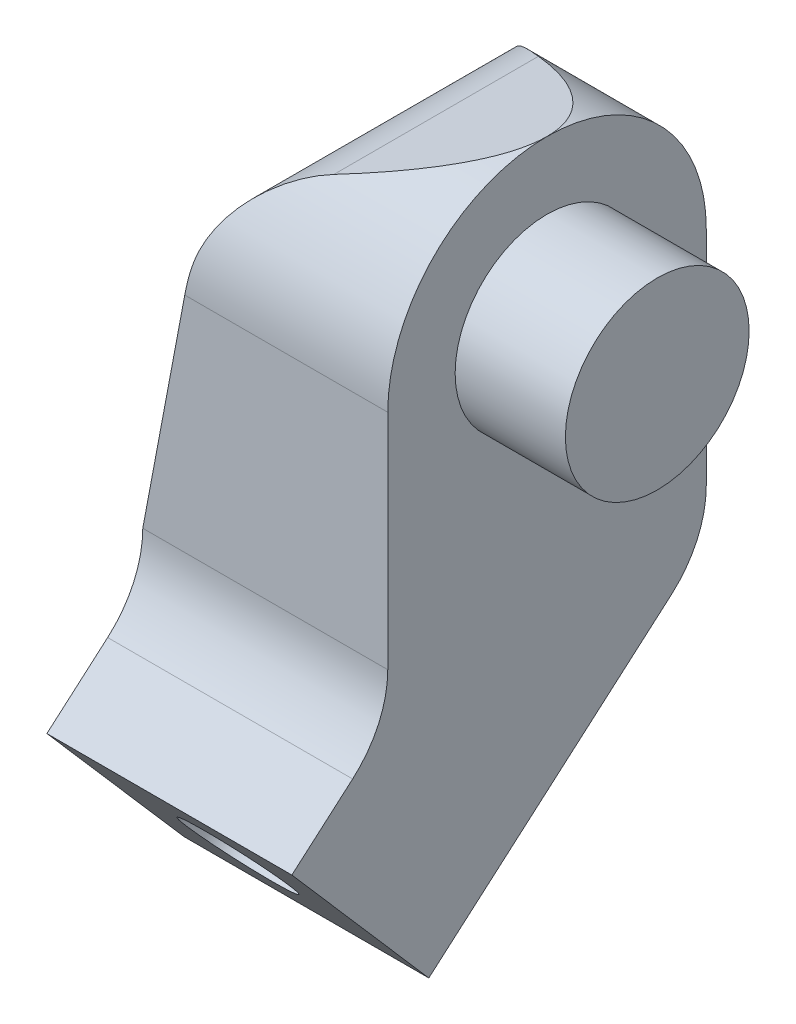
ISO-10303-21;
HEADER;
FILE_DESCRIPTION(('STEP AP214'),'2;1');
FILE_NAME('part.step','',(''),(''),'','','');
FILE_SCHEMA(('AUTOMOTIVE_DESIGN { 1 0 10303 214 1 1 1 1 }'));
ENDSEC;
DATA;
#1=APPLICATION_CONTEXT('core data for automotive mechanical design processes');
#2=APPLICATION_PROTOCOL_DEFINITION('international standard','automotive_design',2000,#1);
#3=PRODUCT_CONTEXT('',#1,'mechanical');
#4=PRODUCT('Part','Part','',(#3));
#5=PRODUCT_RELATED_PRODUCT_CATEGORY('part','',(#4));
#6=PRODUCT_DEFINITION_FORMATION('','',#4);
#7=PRODUCT_DEFINITION_CONTEXT('part definition',#1,'design');
#8=PRODUCT_DEFINITION('design','',#6,#7);
#9=PRODUCT_DEFINITION_SHAPE('','',#8);
#10=(LENGTH_UNIT() NAMED_UNIT(*) SI_UNIT(.MILLI.,.METRE.));
#11=(NAMED_UNIT(*) PLANE_ANGLE_UNIT() SI_UNIT($,.RADIAN.));
#12=(NAMED_UNIT(*) SI_UNIT($,.STERADIAN.) SOLID_ANGLE_UNIT());
#13=UNCERTAINTY_MEASURE_WITH_UNIT(LENGTH_MEASURE(1.E-05),#10,'distance_accuracy_value','');
#14=(GEOMETRIC_REPRESENTATION_CONTEXT(3) GLOBAL_UNCERTAINTY_ASSIGNED_CONTEXT((#13)) GLOBAL_UNIT_ASSIGNED_CONTEXT((#10,
#11,#12)) REPRESENTATION_CONTEXT('',''));
#15=CARTESIAN_POINT('',(0.,0.,0.));
#16=DIRECTION('',(0.,0.,1.));
#17=DIRECTION('',(1.,0.,0.));
#18=AXIS2_PLACEMENT_3D('',#15,#16,#17);
#19=CARTESIAN_POINT('',(6.,8.60181718061073,-2.34888383201306));
#20=DIRECTION('',(-1.,0.,0.));
#21=DIRECTION('',(0.,0.,1.));
#22=AXIS2_PLACEMENT_3D('',#19,#20,#21);
#23=CYLINDRICAL_SURFACE('',#22,7.8);
#24=CARTESIAN_POINT('',(-3.7518731242037,9.6213140172715,-10.0819702921555));
#25=CARTESIAN_POINT('',(-3.72040482142357,9.78862160016256,-10.0599506124846));
#26=CARTESIAN_POINT('',(-3.68244296723893,9.95392084185481,-10.0325992744046));
#27=CARTESIAN_POINT('',(-3.59441622618736,10.279106002383,-9.96820016888319));
#28=CARTESIAN_POINT('',(-3.5443667694772,10.4389985287406,-9.93116475848231));
#29=CARTESIAN_POINT('',(-3.43349119680963,10.7509235156319,-9.84869532873649));
#30=CARTESIAN_POINT('',(-3.37277140463888,10.9030159810995,-9.80334399509971));
#31=CARTESIAN_POINT('',(-3.24110732148407,11.2001854745527,-9.70503615753512));
#32=CARTESIAN_POINT('',(-3.17016001248024,11.3452604148132,-9.65207740876503));
#33=CARTESIAN_POINT('',(-3.01929703081657,11.6270469380141,-9.53991022564862));
#34=CARTESIAN_POINT('',(-2.93942970466804,11.7637979410338,-9.48073557636642));
#35=CARTESIAN_POINT('',(-2.77123898070964,12.0293465629175,-9.35698810157941));
#36=CARTESIAN_POINT('',(-2.68291615965515,12.1581447232663,-9.29241564430101));
#37=CARTESIAN_POINT('',(-2.40562601500489,12.533178022547,-9.09164598642383));
#38=CARTESIAN_POINT('',(-2.20477043965822,12.7672537538619,-8.94872446074746));
#39=CARTESIAN_POINT('',(-1.8656343285898,13.1108922068112,-8.7153355351938));
#40=CARTESIAN_POINT('',(-1.73624789513821,13.2316323093211,-8.62788625076554));
#41=CARTESIAN_POINT('',(-1.46861084682825,13.4618024296429,-8.45146809573977));
#42=CARTESIAN_POINT('',(-1.33035818537985,13.5712298208069,-8.36249887779836));
#43=CARTESIAN_POINT('',(-1.04561744743594,13.7783657255935,-8.18514100931007));
#44=CARTESIAN_POINT('',(-0.899149146929497,13.8761007441663,-8.09675149212534));
#45=CARTESIAN_POINT('',(-0.597730754431411,14.0599161838893,-7.92249860398983));
#46=CARTESIAN_POINT('',(-0.442784558098889,14.1460018958655,-7.83663410020362));
#47=CARTESIAN_POINT('',(-0.147686269451717,14.2943474385709,-7.68224884144286));
#48=CARTESIAN_POINT('',(-0.0087244359166494,14.358248616293,-7.61303831961994));
#49=CARTESIAN_POINT('',(0.27568282517508,14.4768692977717,-7.48033372155783));
#50=CARTESIAN_POINT('',(0.421128468433315,14.5315884957759,-7.4168398357106));
#51=CARTESIAN_POINT('',(0.569888598836617,14.5814876415391,-7.35723098239121));
#52=B_SPLINE_CURVE_WITH_KNOTS('',3,(#24,#25,#26,#27,#28,#29,#30,#31,#32,#33,#34,#35,#36,#37,#38,
#39,#40,#41,#42,#43,#44,#45,#46,#47,#48,#49,#50,#51),.UNSPECIFIED.,.F.,.F.,(4,2,2,2,2,2,2,2,2,2,
2,2,2,4),(0.,0.514643219518378,1.02863292328917,1.53776477477571,2.04704717378775,
2.55369218797799,3.06030266813676,4.07639389791824,4.66818201550808,5.26010723059545,
5.85066413459517,6.44095191559205,6.94414665074033,7.4473581385416),.UNSPECIFIED.);
#53=CARTESIAN_POINT('',(-3.75187312420371,9.6213140172715,-10.0819702921555));
#54=VERTEX_POINT('',#53);
#55=CARTESIAN_POINT('',(0.569888598836618,14.5814876415391,-7.35723098239122));
#56=VERTEX_POINT('',#55);
#57=EDGE_CURVE('E53',#54,#56,#52,.T.);
#58=ORIENTED_EDGE('',*,*,#57,.T.);
#59=CARTESIAN_POINT('',(-17.2676930302822,8.60181718061073,-2.34888383201306));
#60=DIRECTION('',(0.317844732319459,-0.94814277729505,0.));
#61=DIRECTION('',(-0.94814277729505,-0.317844732319459,0.));
#62=AXIS2_PLACEMENT_3D('',#59,#60,#61);
#63=ELLIPSE('',#62,24.5402840030722,7.8);
#64=CARTESIAN_POINT('',(6.,16.4018171806107,-2.34888383201306));
#65=VERTEX_POINT('',#64);
#66=EDGE_CURVE('E140',#56,#65,#63,.T.);
#67=ORIENTED_EDGE('',*,*,#66,.T.);
#68=CARTESIAN_POINT('',(6.,8.60181718061073,-2.34888383201306));
#69=DIRECTION('',(1.,0.,0.));
#70=DIRECTION('',(0.,0.,-1.));
#71=AXIS2_PLACEMENT_3D('',#68,#69,#70);
#72=CIRCLE('',#71,7.8);
#73=CARTESIAN_POINT('',(6.,8.60181718061073,-10.1488838320131));
#74=VERTEX_POINT('',#73);
#75=EDGE_CURVE('E271',#74,#65,#72,.T.);
#76=ORIENTED_EDGE('',*,*,#75,.F.);
#77=DIRECTION('',(-1.,0.,0.));
#78=VECTOR('',#77,1.);
#79=CARTESIAN_POINT('',(6.,8.60181718061073,-10.1488838320131));
#80=LINE('',#79,#78);
#81=CARTESIAN_POINT('',(-3.94383490387815,8.60181718061073,-10.1488838320131));
#82=VERTEX_POINT('',#81);
#83=EDGE_CURVE('E155',#74,#82,#80,.T.);
#84=ORIENTED_EDGE('',*,*,#83,.T.);
#85=CARTESIAN_POINT('',(-3.94383490387815,8.60181718061073,-2.34888383201306));
#86=DIRECTION('',(0.98273115124874,-0.185039142792347,0.));
#87=DIRECTION('',(-0.185039142792347,-0.98273115124874,0.));
#88=AXIS2_PLACEMENT_3D('',#85,#86,#87);
#89=ELLIPSE('',#88,7.93706395700255,7.8);
#90=EDGE_CURVE('E236',#82,#54,#89,.T.);
#91=ORIENTED_EDGE('',*,*,#90,.T.);
#92=EDGE_LOOP('',(#58,#67,#76,#84,#91));
#93=FACE_BOUND('',#92,.T.);
#94=ADVANCED_FACE('F43',(#93),#23,.T.);
#95=CARTESIAN_POINT('',(6.,-2.31834523246805,-5.14888383201306));
#96=DIRECTION('',(-1.,0.,0.));
#97=DIRECTION('',(0.,0.,1.));
#98=AXIS2_PLACEMENT_3D('',#95,#96,#97);
#99=CYLINDRICAL_SURFACE('',#98,5.);
#100=CARTESIAN_POINT('',(-6.,-2.31834523246805,-5.14888383201306));
#101=DIRECTION('',(1.,0.,0.));
#102=DIRECTION('',(0.,0.,1.));
#103=AXIS2_PLACEMENT_3D('',#100,#101,#102);
#104=CIRCLE('',#103,5.);
#105=CARTESIAN_POINT('',(-6.,-6.09320333488858,-8.42767115457458));
#106=VERTEX_POINT('',#105);
#107=CARTESIAN_POINT('',(-6.,-2.31834523246805,-10.1488838320131));
#108=VERTEX_POINT('',#107);
#109=EDGE_CURVE('E136',#106,#108,#104,.T.);
#110=ORIENTED_EDGE('',*,*,#109,.T.);
#111=DIRECTION('',(-1.,0.,0.));
#112=VECTOR('',#111,1.);
#113=CARTESIAN_POINT('',(6.,-2.31834523246805,-10.1488838320131));
#114=LINE('',#113,#112);
#115=CARTESIAN_POINT('',(6.,-2.31834523246805,-10.1488838320131));
#116=VERTEX_POINT('',#115);
#117=EDGE_CURVE('E158',#116,#108,#114,.T.);
#118=ORIENTED_EDGE('',*,*,#117,.F.);
#119=CARTESIAN_POINT('',(6.,-2.31834523246805,-5.14888383201306));
#120=DIRECTION('',(1.,0.,0.));
#121=DIRECTION('',(0.,0.,1.));
#122=AXIS2_PLACEMENT_3D('',#119,#120,#121);
#123=CIRCLE('',#122,5.);
#124=CARTESIAN_POINT('',(6.,-6.09320333488858,-8.42767115457458));
#125=VERTEX_POINT('',#124);
#126=EDGE_CURVE('E145',#125,#116,#123,.T.);
#127=ORIENTED_EDGE('',*,*,#126,.F.);
#128=DIRECTION('',(-1.,0.,0.));
#129=VECTOR('',#128,1.);
#130=CARTESIAN_POINT('',(6.,-6.09320333488858,-8.42767115457458));
#131=LINE('',#130,#129);
#132=EDGE_CURVE('E132',#125,#106,#131,.T.);
#133=ORIENTED_EDGE('',*,*,#132,.T.);
#134=EDGE_LOOP('',(#110,#118,#127,#133));
#135=FACE_BOUND('',#134,.T.);
#136=ADVANCED_FACE('F45',(#135),#99,.T.);
#137=CARTESIAN_POINT('',(6.,8.60181718061073,-10.1488838320131));
#138=DIRECTION('',(0.,0.,1.));
#139=DIRECTION('',(0.,-1.,0.));
#140=AXIS2_PLACEMENT_3D('',#137,#138,#139);
#141=PLANE('',#140);
#142=ORIENTED_EDGE('',*,*,#117,.T.);
#143=DIRECTION('',(0.185039142792347,0.98273115124874,0.));
#144=VECTOR('',#143,1.);
#145=CARTESIAN_POINT('',(-6.,-2.31834523246806,-10.1488838320131));
#146=LINE('',#145,#144);
#147=EDGE_CURVE('E258',#108,#82,#146,.T.);
#148=ORIENTED_EDGE('',*,*,#147,.T.);
#149=ORIENTED_EDGE('',*,*,#83,.F.);
#150=DIRECTION('',(0.,1.,0.));
#151=VECTOR('',#150,1.);
#152=CARTESIAN_POINT('',(6.,8.60181718061073,-10.1488838320131));
#153=LINE('',#152,#151);
#154=EDGE_CURVE('E97',#116,#74,#153,.T.);
#155=ORIENTED_EDGE('',*,*,#154,.F.);
#156=EDGE_LOOP('',(#142,#148,#149,#155));
#157=FACE_BOUND('',#156,.T.);
#158=ADVANCED_FACE('F217',(#157),#141,.F.);
#159=CARTESIAN_POINT('',(0.569888598836618,14.5814876415391,2.6594633183651));
#160=CARTESIAN_POINT('',(0.474869122611542,14.549629806968,2.69750335895821));
#161=CARTESIAN_POINT('',(0.381202870917581,14.5157906362718,2.73716407564953));
#162=CARTESIAN_POINT('',(0.196562426316279,14.4442995376708,2.81912827303426));
#163=CARTESIAN_POINT('',(0.105587237736117,14.406649043317,2.86143075780439));
#164=CARTESIAN_POINT('',(-0.163180125241088,14.2882765816196,2.99132849285983));
#165=CARTESIAN_POINT('',(-0.337076940841386,14.2020446411511,3.08202260341075));
#166=CARTESIAN_POINT('',(-0.675412377725135,14.0152427001432,3.26826153402024));
#167=CARTESIAN_POINT('',(-0.839804758617268,13.9146097313025,3.36382640318471));
#168=CARTESIAN_POINT('',(-1.15851281001664,13.6996143822054,3.55647896644144));
#169=CARTESIAN_POINT('',(-1.31282477246139,13.5852469931899,3.6535672047962));
#170=CARTESIAN_POINT('',(-1.61053494053764,13.3434545441036,3.84633165900787));
#171=CARTESIAN_POINT('',(-1.75397393945111,13.2160829781851,3.94201194362082));
#172=CARTESIAN_POINT('',(-2.03010271977031,12.9479781226146,4.13013631396915));
#173=CARTESIAN_POINT('',(-2.1627930458437,12.807245510793,4.2225805635492));
#174=CARTESIAN_POINT('',(-2.41639993475961,12.5127240562341,4.40200527598845));
#175=CARTESIAN_POINT('',(-2.53733317406715,12.3589543032114,4.4889934138185));
#176=CARTESIAN_POINT('',(-2.76644673982357,12.0384547286058,4.655551084694));
#177=CARTESIAN_POINT('',(-2.87463149924677,11.8717294456572,4.73512319445858));
#178=CARTESIAN_POINT('',(-3.05190884970784,11.568459180273,4.8663236110154));
#179=CARTESIAN_POINT('',(-3.12406878750085,11.4345882531858,4.92000879097829));
#180=CARTESIAN_POINT('',(-3.25961273962997,11.1601964852453,5.02105879981));
#181=CARTESIAN_POINT('',(-3.32299898235031,11.0196773451473,5.06842523343251));
#182=CARTESIAN_POINT('',(-3.44010779684677,10.7329288503957,5.15583294978895));
#183=CARTESIAN_POINT('',(-3.49385550857693,10.5867155982453,5.19589329361038));
#184=CARTESIAN_POINT('',(-3.59113277428573,10.2890671706347,5.26797899688435));
#185=CARTESIAN_POINT('',(-3.63466922711365,10.1376356005239,5.3000097822156));
#186=CARTESIAN_POINT('',(-3.68762858193257,9.92423577446366,5.33843813909004));
#187=CARTESIAN_POINT('',(-3.7016618348059,9.86403757443673,5.3485540226521));
#188=CARTESIAN_POINT('',(-3.72803926407861,9.7430849480309,5.36741389760584));
#189=CARTESIAN_POINT('',(-3.74038411218101,9.68233075316834,5.37615843476847));
#190=CARTESIAN_POINT('',(-3.75187312420371,9.62131401727151,5.3842026281294));
#191=B_SPLINE_CURVE_WITH_KNOTS('',3,(#159,#160,#161,#162,#163,#164,#165,#166,#167,#168,#169,
#170,#171,#172,#173,#174,#175,#176,#177,#178,#179,#180,#181,#182,#183,#184,#185,#186,#187,#188,
#189,#190),.UNSPECIFIED.,.F.,.F.,(4,2,2,2,2,2,2,2,2,2,2,2,2,2,2,4),(0.,0.32148633308496,
0.642852191858168,1.28469364951025,1.9294325393531,2.57440727496946,3.21682826577604,
3.8592166827841,4.5006802075037,5.14192001652013,5.62530529075375,6.1085675663606,
6.59055042189803,7.0722066999434,7.26007797440005,7.44787428871104),.UNSPECIFIED.);
#192=CARTESIAN_POINT('',(0.569888598836618,14.5814876415391,2.6594633183651));
#193=VERTEX_POINT('',#192);
#194=CARTESIAN_POINT('',(-3.75187312420371,9.6213140172715,5.3842026281294));
#195=VERTEX_POINT('',#194);
#196=EDGE_CURVE('E160',#193,#195,#191,.T.);
#197=ORIENTED_EDGE('',*,*,#196,.T.);
#198=CARTESIAN_POINT('',(-3.94383490387815,8.60181718061073,5.45111616798694));
#199=VERTEX_POINT('',#198);
#200=EDGE_CURVE('E252',#195,#199,#89,.T.);
#201=ORIENTED_EDGE('',*,*,#200,.T.);
#202=DIRECTION('',(-1.,0.,0.));
#203=VECTOR('',#202,1.);
#204=CARTESIAN_POINT('',(6.,8.60181718061073,5.45111616798694));
#205=LINE('',#204,#203);
#206=CARTESIAN_POINT('',(6.,8.60181718061073,5.45111616798694));
#207=VERTEX_POINT('',#206);
#208=EDGE_CURVE('E152',#207,#199,#205,.T.);
#209=ORIENTED_EDGE('',*,*,#208,.F.);
#210=EDGE_CURVE('E270',#65,#207,#72,.T.);
#211=ORIENTED_EDGE('',*,*,#210,.F.);
#212=EDGE_CURVE('E265',#65,#193,#63,.T.);
#213=ORIENTED_EDGE('',*,*,#212,.T.);
#214=EDGE_LOOP('',(#197,#201,#209,#211,#213));
#215=FACE_BOUND('',#214,.T.);
#216=ADVANCED_FACE('F173',(#215),#23,.T.);
#217=CARTESIAN_POINT('',(6.,8.60181718061073,5.45111616798694));
#218=DIRECTION('',(0.,0.,-1.));
#219=DIRECTION('',(0.,1.,0.));
#220=AXIS2_PLACEMENT_3D('',#217,#218,#219);
#221=PLANE('',#220);
#222=ORIENTED_EDGE('',*,*,#208,.T.);
#223=DIRECTION('',(-0.185039142792347,-0.98273115124874,0.));
#224=VECTOR('',#223,1.);
#225=CARTESIAN_POINT('',(-3.60336312415542,10.4100412082701,5.45111616798694));
#226=LINE('',#225,#224);
#227=CARTESIAN_POINT('',(-6.,-2.31834523246806,5.45111616798694));
#228=VERTEX_POINT('',#227);
#229=EDGE_CURVE('E255',#199,#228,#226,.T.);
#230=ORIENTED_EDGE('',*,*,#229,.T.);
#231=DIRECTION('',(-1.,0.,0.));
#232=VECTOR('',#231,1.);
#233=CARTESIAN_POINT('',(6.,-2.31834523246806,5.45111616798694));
#234=LINE('',#233,#232);
#235=CARTESIAN_POINT('',(6.,-2.31834523246806,5.45111616798694));
#236=VERTEX_POINT('',#235);
#237=EDGE_CURVE('E149',#236,#228,#234,.T.);
#238=ORIENTED_EDGE('',*,*,#237,.F.);
#239=DIRECTION('',(0.,-1.,0.));
#240=VECTOR('',#239,1.);
#241=CARTESIAN_POINT('',(6.,8.60181718061073,5.45111616798694));
#242=LINE('',#241,#240);
#243=EDGE_CURVE('E274',#207,#236,#242,.T.);
#244=ORIENTED_EDGE('',*,*,#243,.F.);
#245=EDGE_LOOP('',(#222,#230,#238,#244));
#246=FACE_BOUND('',#245,.T.);
#247=ADVANCED_FACE('F210',(#246),#221,.F.);
#248=CARTESIAN_POINT('',(6.,-2.31834523246806,10.4511161679869));
#249=DIRECTION('',(-1.,0.,0.));
#250=DIRECTION('',(0.,0.,1.));
#251=AXIS2_PLACEMENT_3D('',#248,#249,#250);
#252=CYLINDRICAL_SURFACE('',#251,5.);
#253=CARTESIAN_POINT('',(-6.,-2.31834523246806,10.4511161679869));
#254=DIRECTION('',(-1.,0.,0.));
#255=DIRECTION('',(0.,0.,1.));
#256=AXIS2_PLACEMENT_3D('',#253,#254,#255);
#257=CIRCLE('',#256,5.);
#258=CARTESIAN_POINT('',(-6.,-6.09320333488858,7.17232884542542));
#259=VERTEX_POINT('',#258);
#260=EDGE_CURVE('E139',#228,#259,#257,.T.);
#261=ORIENTED_EDGE('',*,*,#260,.T.);
#262=DIRECTION('',(-1.,0.,0.));
#263=VECTOR('',#262,1.);
#264=CARTESIAN_POINT('',(6.,-6.09320333488858,7.17232884542542));
#265=LINE('',#264,#263);
#266=CARTESIAN_POINT('',(6.,-6.09320333488858,7.17232884542542));
#267=VERTEX_POINT('',#266);
#268=EDGE_CURVE('E127',#267,#259,#265,.T.);
#269=ORIENTED_EDGE('',*,*,#268,.F.);
#270=CARTESIAN_POINT('',(6.,-2.31834523246806,10.4511161679869));
#271=DIRECTION('',(-1.,0.,0.));
#272=DIRECTION('',(0.,0.,1.));
#273=AXIS2_PLACEMENT_3D('',#270,#271,#272);
#274=CIRCLE('',#273,5.);
#275=EDGE_CURVE('E118',#236,#267,#274,.T.);
#276=ORIENTED_EDGE('',*,*,#275,.F.);
#277=ORIENTED_EDGE('',*,*,#237,.T.);
#278=EDGE_LOOP('',(#261,#269,#276,#277));
#279=FACE_BOUND('',#278,.T.);
#280=ADVANCED_FACE('F208',(#279),#252,.F.);
#281=CARTESIAN_POINT('',(6.,-6.09320333488858,7.17232884542542));
#282=DIRECTION('',(0.,-0.754971620484105,-0.655757464512304));
#283=DIRECTION('',(0.,0.655757464512304,-0.754971620484105));
#284=AXIS2_PLACEMENT_3D('',#281,#282,#283);
#285=PLANE('',#284);
#286=DIRECTION('',(0.,-0.655757464512304,0.754971620484104));
#287=VECTOR('',#286,1.);
#288=CARTESIAN_POINT('',(-6.,-6.09320333488858,7.17232884542542));
#289=LINE('',#288,#287);
#290=CARTESIAN_POINT('',(-6.,-8.67859608082327,10.1488838320131));
#291=VERTEX_POINT('',#290);
#292=EDGE_CURVE('E126',#259,#291,#289,.T.);
#293=ORIENTED_EDGE('',*,*,#292,.T.);
#294=DIRECTION('',(-1.,0.,0.));
#295=VECTOR('',#294,1.);
#296=CARTESIAN_POINT('',(6.,-8.67859608082327,10.1488838320131));
#297=LINE('',#296,#295);
#298=CARTESIAN_POINT('',(6.,-8.67859608082327,10.1488838320131));
#299=VERTEX_POINT('',#298);
#300=EDGE_CURVE('E123',#299,#291,#297,.T.);
#301=ORIENTED_EDGE('',*,*,#300,.F.);
#302=DIRECTION('',(0.,-0.655757464512304,0.754971620484104));
#303=VECTOR('',#302,1.);
#304=CARTESIAN_POINT('',(6.,-6.09320333488858,7.17232884542542));
#305=LINE('',#304,#303);
#306=EDGE_CURVE('E112',#267,#299,#305,.T.);
#307=ORIENTED_EDGE('',*,*,#306,.F.);
#308=ORIENTED_EDGE('',*,*,#268,.T.);
#309=EDGE_LOOP('',(#293,#301,#307,#308));
#310=FACE_BOUND('',#309,.T.);
#311=ADVANCED_FACE('F124',(#310),#285,.F.);
#312=CARTESIAN_POINT('',(6.,-16.4018171806107,3.44060533670083));
#313=DIRECTION('',(0.,0.655757464512303,-0.754971620484105));
#314=DIRECTION('',(0.,0.754971620484105,0.655757464512303));
#315=AXIS2_PLACEMENT_3D('',#312,#313,#314);
#316=PLANE('',#315);
#317=CARTESIAN_POINT('',(0.,-12.5440507777019,6.79140561371006));
#318=DIRECTION('',(0.,0.655757464512303,-0.754971620484105));
#319=DIRECTION('',(0.,0.754971620484105,0.655757464512303));
#320=AXIS2_PLACEMENT_3D('',#317,#318,#319);
#321=CIRCLE('',#320,2.5);
#322=CARTESIAN_POINT('',(0.,-10.6566217264916,8.43079927499082));
#323=VERTEX_POINT('',#322);
#324=EDGE_CURVE('E47',#323,#323,#321,.F.);
#325=ORIENTED_EDGE('',*,*,#324,.F.);
#326=EDGE_LOOP('',(#325));
#327=FACE_BOUND('',#326,.T.);
#328=DIRECTION('',(0.,-0.754971620484105,-0.655757464512303));
#329=VECTOR('',#328,1.);
#330=CARTESIAN_POINT('',(-6.,-16.4018171806107,3.44060533670083));
#331=LINE('',#330,#329);
#332=CARTESIAN_POINT('',(-6.,-16.4018171806107,3.44060533670083));
#333=VERTEX_POINT('',#332);
#334=EDGE_CURVE('E82',#291,#333,#331,.T.);
#335=ORIENTED_EDGE('',*,*,#334,.T.);
#336=DIRECTION('',(-1.,0.,0.));
#337=VECTOR('',#336,1.);
#338=CARTESIAN_POINT('',(6.,-16.4018171806107,3.44060533670083));
#339=LINE('',#338,#337);
#340=CARTESIAN_POINT('',(6.,-16.4018171806107,3.44060533670083));
#341=VERTEX_POINT('',#340);
#342=EDGE_CURVE('E128',#341,#333,#339,.T.);
#343=ORIENTED_EDGE('',*,*,#342,.F.);
#344=DIRECTION('',(0.,-0.754971620484105,-0.655757464512303));
#345=VECTOR('',#344,1.);
#346=CARTESIAN_POINT('',(6.,-16.4018171806107,3.44060533670083));
#347=LINE('',#346,#345);
#348=EDGE_CURVE('E116',#299,#341,#347,.T.);
#349=ORIENTED_EDGE('',*,*,#348,.F.);
#350=ORIENTED_EDGE('',*,*,#300,.T.);
#351=EDGE_LOOP('',(#335,#343,#349,#350));
#352=FACE_BOUND('',#351,.T.);
#353=ADVANCED_FACE('F130',(#327,#352),#316,.F.);
#354=CARTESIAN_POINT('',(6.,-6.09320333488858,-8.42767115457458));
#355=DIRECTION('',(0.,0.754971620484105,0.655757464512303));
#356=DIRECTION('',(0.,-0.655757464512303,0.754971620484105));
#357=AXIS2_PLACEMENT_3D('',#354,#355,#356);
#358=PLANE('',#357);
#359=DIRECTION('',(0.,0.655757464512303,-0.754971620484105));
#360=VECTOR('',#359,1.);
#361=CARTESIAN_POINT('',(-6.,-6.09320333488858,-8.42767115457458));
#362=LINE('',#361,#360);
#363=EDGE_CURVE('E88',#333,#106,#362,.T.);
#364=ORIENTED_EDGE('',*,*,#363,.T.);
#365=ORIENTED_EDGE('',*,*,#132,.F.);
#366=DIRECTION('',(0.,0.655757464512303,-0.754971620484105));
#367=VECTOR('',#366,1.);
#368=CARTESIAN_POINT('',(6.,-6.09320333488858,-8.42767115457458));
#369=LINE('',#368,#367);
#370=EDGE_CURVE('E61',#341,#125,#369,.T.);
#371=ORIENTED_EDGE('',*,*,#370,.F.);
#372=ORIENTED_EDGE('',*,*,#342,.T.);
#373=EDGE_LOOP('',(#364,#365,#371,#372));
#374=FACE_BOUND('',#373,.T.);
#375=ADVANCED_FACE('F196',(#374),#358,.F.);
#376=CARTESIAN_POINT('',(6.,-2.31834523246805,-5.14888383201306));
#377=DIRECTION('',(-1.,0.,0.));
#378=DIRECTION('',(0.,0.,1.));
#379=AXIS2_PLACEMENT_3D('',#376,#377,#378);
#380=PLANE('',#379);
#381=CARTESIAN_POINT('',(6.,8.60181718061073,-2.34888383201306));
#382=DIRECTION('',(-1.,0.,0.));
#383=DIRECTION('',(0.,0.,1.));
#384=AXIS2_PLACEMENT_3D('',#381,#382,#383);
#385=CIRCLE('',#384,4.5);
#386=CARTESIAN_POINT('',(6.,8.60181718061073,2.15111616798694));
#387=VERTEX_POINT('',#386);
#388=EDGE_CURVE('E11',#387,#387,#385,.F.);
#389=ORIENTED_EDGE('',*,*,#388,.F.);
#390=EDGE_LOOP('',(#389));
#391=FACE_BOUND('',#390,.T.);
#392=ORIENTED_EDGE('',*,*,#126,.T.);
#393=ORIENTED_EDGE('',*,*,#154,.T.);
#394=ORIENTED_EDGE('',*,*,#75,.T.);
#395=ORIENTED_EDGE('',*,*,#210,.T.);
#396=ORIENTED_EDGE('',*,*,#243,.T.);
#397=ORIENTED_EDGE('',*,*,#275,.T.);
#398=ORIENTED_EDGE('',*,*,#306,.T.);
#399=ORIENTED_EDGE('',*,*,#348,.T.);
#400=ORIENTED_EDGE('',*,*,#370,.T.);
#401=EDGE_LOOP('',(#392,#393,#394,#395,#396,#397,#398,#399,#400));
#402=FACE_BOUND('',#401,.T.);
#403=ADVANCED_FACE('F114',(#391,#402),#380,.F.);
#404=CARTESIAN_POINT('',(-6.,-2.31834523246805,-5.14888383201306));
#405=DIRECTION('',(-1.,0.,0.));
#406=DIRECTION('',(0.,0.,1.));
#407=AXIS2_PLACEMENT_3D('',#404,#405,#406);
#408=PLANE('',#407);
#409=DIRECTION('',(0.,0.,1.));
#410=VECTOR('',#409,1.);
#411=CARTESIAN_POINT('',(-6.,-2.31834523246806,-10.1488838320131));
#412=LINE('',#411,#410);
#413=EDGE_CURVE('E253',#108,#228,#412,.T.);
#414=ORIENTED_EDGE('',*,*,#413,.F.);
#415=ORIENTED_EDGE('',*,*,#109,.F.);
#416=ORIENTED_EDGE('',*,*,#363,.F.);
#417=ORIENTED_EDGE('',*,*,#334,.F.);
#418=ORIENTED_EDGE('',*,*,#292,.F.);
#419=ORIENTED_EDGE('',*,*,#260,.F.);
#420=EDGE_LOOP('',(#414,#415,#416,#417,#418,#419));
#421=FACE_BOUND('',#420,.T.);
#422=ADVANCED_FACE('F182',(#421),#408,.T.);
#423=CARTESIAN_POINT('',(2.6358793589131,8.41855958912125,-10.1488838320131));
#424=DIRECTION('',(0.,0.,1.));
#425=DIRECTION('',(1.,0.,0.));
#426=AXIS2_PLACEMENT_3D('',#423,#424,#425);
#427=CYLINDRICAL_SURFACE('',#426,6.5);
#428=DIRECTION('',(0.,0.,1.));
#429=VECTOR('',#428,1.);
#430=CARTESIAN_POINT('',(-3.75187312420371,9.6213140172715,-10.1488838320131));
#431=LINE('',#430,#429);
#432=EDGE_CURVE('E243',#54,#195,#431,.T.);
#433=ORIENTED_EDGE('',*,*,#432,.T.);
#434=ORIENTED_EDGE('',*,*,#196,.F.);
#435=DIRECTION('',(0.,0.,1.));
#436=VECTOR('',#435,1.);
#437=CARTESIAN_POINT('',(0.569888598836618,14.5814876415391,-10.1488838320131));
#438=LINE('',#437,#436);
#439=EDGE_CURVE('E245',#56,#193,#438,.T.);
#440=ORIENTED_EDGE('',*,*,#439,.F.);
#441=ORIENTED_EDGE('',*,*,#57,.F.);
#442=EDGE_LOOP('',(#433,#434,#440,#441));
#443=FACE_BOUND('',#442,.T.);
#444=ADVANCED_FACE('F176',(#443),#427,.T.);
#445=CARTESIAN_POINT('',(0.569888598836618,14.5814876415391,-10.1488838320131));
#446=DIRECTION('',(0.317844732319459,-0.94814277729505,0.));
#447=DIRECTION('',(0.94814277729505,0.317844732319459,0.));
#448=AXIS2_PLACEMENT_3D('',#445,#446,#447);
#449=PLANE('',#448);
#450=ORIENTED_EDGE('',*,*,#439,.T.);
#451=ORIENTED_EDGE('',*,*,#212,.F.);
#452=ORIENTED_EDGE('',*,*,#66,.F.);
#453=EDGE_LOOP('',(#450,#451,#452));
#454=FACE_BOUND('',#453,.T.);
#455=ADVANCED_FACE('F181',(#454),#449,.F.);
#456=CARTESIAN_POINT('',(-6.,-2.31834523246806,-10.1488838320131));
#457=DIRECTION('',(0.98273115124874,-0.185039142792347,0.));
#458=DIRECTION('',(0.185039142792347,0.98273115124874,0.));
#459=AXIS2_PLACEMENT_3D('',#456,#457,#458);
#460=PLANE('',#459);
#461=ORIENTED_EDGE('',*,*,#147,.F.);
#462=ORIENTED_EDGE('',*,*,#413,.T.);
#463=ORIENTED_EDGE('',*,*,#229,.F.);
#464=ORIENTED_EDGE('',*,*,#200,.F.);
#465=ORIENTED_EDGE('',*,*,#432,.F.);
#466=ORIENTED_EDGE('',*,*,#90,.F.);
#467=EDGE_LOOP('',(#461,#462,#463,#464,#465,#466));
#468=FACE_BOUND('',#467,.T.);
#469=ADVANCED_FACE('F186',(#468),#460,.F.);
#470=CARTESIAN_POINT('',(11.4,8.60181718061073,-2.34888383201306));
#471=DIRECTION('',(-1.,0.,0.));
#472=DIRECTION('',(0.,0.,1.));
#473=AXIS2_PLACEMENT_3D('',#470,#471,#472);
#474=CYLINDRICAL_SURFACE('',#473,4.5);
#475=CARTESIAN_POINT('',(11.4,8.60181718061073,-2.34888383201306));
#476=DIRECTION('',(1.,0.,0.));
#477=DIRECTION('',(0.,0.,-1.));
#478=AXIS2_PLACEMENT_3D('',#475,#476,#477);
#479=CIRCLE('',#478,4.5);
#480=CARTESIAN_POINT('',(11.4,8.60181718061073,2.15111616798694));
#481=VERTEX_POINT('',#480);
#482=EDGE_CURVE('E290',#481,#481,#479,.T.);
#483=CARTESIAN_POINT('',(11.4,8.60181718061073,2.15111616798694));
#484=CARTESIAN_POINT('',(11.34375,8.60181718061073,2.15111616798694));
#485=CARTESIAN_POINT('',(11.2875,8.60181718061073,2.15111616798694));
#486=CARTESIAN_POINT('',(11.175,8.60181718061073,2.15111616798694));
#487=CARTESIAN_POINT('',(11.11875,8.60181718061073,2.15111616798694));
#488=CARTESIAN_POINT('',(11.00625,8.60181718061073,2.15111616798694));
#489=CARTESIAN_POINT('',(10.95,8.60181718061073,2.15111616798694));
#490=CARTESIAN_POINT('',(10.8375,8.60181718061073,2.15111616798694));
#491=CARTESIAN_POINT('',(10.78125,8.60181718061073,2.15111616798694));
#492=CARTESIAN_POINT('',(10.66875,8.60181718061073,2.15111616798694));
#493=CARTESIAN_POINT('',(10.6125,8.60181718061073,2.15111616798694));
#494=CARTESIAN_POINT('',(10.5,8.60181718061073,2.15111616798694));
#495=CARTESIAN_POINT('',(10.44375,8.60181718061073,2.15111616798694));
#496=CARTESIAN_POINT('',(10.33125,8.60181718061073,2.15111616798694));
#497=CARTESIAN_POINT('',(10.275,8.60181718061073,2.15111616798694));
#498=CARTESIAN_POINT('',(10.1625,8.60181718061073,2.15111616798694));
#499=CARTESIAN_POINT('',(10.10625,8.60181718061073,2.15111616798694));
#500=CARTESIAN_POINT('',(9.99375,8.60181718061073,2.15111616798694));
#501=CARTESIAN_POINT('',(9.9375,8.60181718061073,2.15111616798694));
#502=CARTESIAN_POINT('',(9.825,8.60181718061073,2.15111616798694));
#503=CARTESIAN_POINT('',(9.76875,8.60181718061073,2.15111616798694));
#504=CARTESIAN_POINT('',(9.65625,8.60181718061073,2.15111616798694));
#505=CARTESIAN_POINT('',(9.6,8.60181718061073,2.15111616798694));
#506=CARTESIAN_POINT('',(9.4875,8.60181718061073,2.15111616798694));
#507=CARTESIAN_POINT('',(9.43125,8.60181718061073,2.15111616798694));
#508=CARTESIAN_POINT('',(9.31875,8.60181718061073,2.15111616798694));
#509=CARTESIAN_POINT('',(9.2625,8.60181718061073,2.15111616798694));
#510=CARTESIAN_POINT('',(9.15,8.60181718061073,2.15111616798694));
#511=CARTESIAN_POINT('',(9.09375,8.60181718061073,2.15111616798694));
#512=CARTESIAN_POINT('',(8.98125,8.60181718061073,2.15111616798694));
#513=CARTESIAN_POINT('',(8.925,8.60181718061073,2.15111616798694));
#514=CARTESIAN_POINT('',(8.8125,8.60181718061073,2.15111616798694));
#515=CARTESIAN_POINT('',(8.75625,8.60181718061073,2.15111616798694));
#516=CARTESIAN_POINT('',(8.64375,8.60181718061073,2.15111616798694));
#517=CARTESIAN_POINT('',(8.5875,8.60181718061073,2.15111616798694));
#518=CARTESIAN_POINT('',(8.475,8.60181718061073,2.15111616798694));
#519=CARTESIAN_POINT('',(8.41875,8.60181718061073,2.15111616798694));
#520=CARTESIAN_POINT('',(8.30625,8.60181718061073,2.15111616798694));
#521=CARTESIAN_POINT('',(8.25,8.60181718061073,2.15111616798694));
#522=CARTESIAN_POINT('',(8.1375,8.60181718061073,2.15111616798694));
#523=CARTESIAN_POINT('',(8.08125,8.60181718061073,2.15111616798694));
#524=CARTESIAN_POINT('',(7.96875,8.60181718061073,2.15111616798694));
#525=CARTESIAN_POINT('',(7.9125,8.60181718061073,2.15111616798694));
#526=CARTESIAN_POINT('',(7.8,8.60181718061073,2.15111616798694));
#527=CARTESIAN_POINT('',(7.74375,8.60181718061073,2.15111616798694));
#528=CARTESIAN_POINT('',(7.63125,8.60181718061073,2.15111616798694));
#529=CARTESIAN_POINT('',(7.575,8.60181718061073,2.15111616798694));
#530=CARTESIAN_POINT('',(7.4625,8.60181718061073,2.15111616798694));
#531=CARTESIAN_POINT('',(7.40625,8.60181718061073,2.15111616798694));
#532=CARTESIAN_POINT('',(7.29375,8.60181718061073,2.15111616798694));
#533=CARTESIAN_POINT('',(7.2375,8.60181718061073,2.15111616798694));
#534=CARTESIAN_POINT('',(7.125,8.60181718061073,2.15111616798694));
#535=CARTESIAN_POINT('',(7.06875,8.60181718061073,2.15111616798694));
#536=CARTESIAN_POINT('',(6.95625,8.60181718061073,2.15111616798694));
#537=CARTESIAN_POINT('',(6.9,8.60181718061073,2.15111616798694));
#538=CARTESIAN_POINT('',(6.7875,8.60181718061073,2.15111616798694));
#539=CARTESIAN_POINT('',(6.73125,8.60181718061073,2.15111616798694));
#540=CARTESIAN_POINT('',(6.61875,8.60181718061073,2.15111616798694));
#541=CARTESIAN_POINT('',(6.5625,8.60181718061073,2.15111616798694));
#542=CARTESIAN_POINT('',(6.45,8.60181718061073,2.15111616798694));
#543=CARTESIAN_POINT('',(6.39375,8.60181718061073,2.15111616798694));
#544=CARTESIAN_POINT('',(6.28125,8.60181718061073,2.15111616798694));
#545=CARTESIAN_POINT('',(6.225,8.60181718061073,2.15111616798694));
#546=CARTESIAN_POINT('',(6.1125,8.60181718061073,2.15111616798694));
#547=CARTESIAN_POINT('',(6.05625,8.60181718061073,2.15111616798694));
#548=CARTESIAN_POINT('',(6.,8.60181718061073,2.15111616798694));
#549=B_SPLINE_CURVE_WITH_KNOTS('',3,(#483,#484,#485,#486,#487,#488,#489,#490,#491,#492,#493,
#494,#495,#496,#497,#498,#499,#500,#501,#502,#503,#504,#505,#506,#507,#508,#509,#510,#511,#512,
#513,#514,#515,#516,#517,#518,#519,#520,#521,#522,#523,#524,#525,#526,#527,#528,#529,#530,#531,
#532,#533,#534,#535,#536,#537,#538,#539,#540,#541,#542,#543,#544,#545,#546,#547,#548),
.UNSPECIFIED.,.F.,.F.,(4,2,2,2,2,2,2,2,2,2,2,2,2,2,2,2,2,2,2,2,2,2,2,2,2,2,2,2,2,2,2,2,4),(0.,
0.168749999999999,0.337499999999999,0.50625,0.674999999999998,0.843749999999999,1.0125,1.18125,
1.35,1.51875,1.6875,1.85625,2.025,2.19375,2.3625,2.53125,2.7,2.86875,3.0375,3.20625,3.375,
3.54375,3.7125,3.88125,4.05,4.21875,4.3875,4.55625,4.725,4.89375,5.0625,5.23125,5.4),.UNSPECIFIED.);
#550=EDGE_CURVE('BSEAM184',#481,#387,#549,.T.);
#551=ORIENTED_EDGE('',*,*,#482,.F.);
#552=ORIENTED_EDGE('',*,*,#388,.T.);
#553=ORIENTED_EDGE('',*,*,#550,.T.);
#554=ORIENTED_EDGE('',*,*,#550,.F.);
#555=EDGE_LOOP('',(#551,#553,#552,#554));
#556=FACE_BOUND('',#555,.T.);
#557=ADVANCED_FACE('F184',(#556),#474,.T.);
#558=CARTESIAN_POINT('',(11.4,8.60181718061073,-2.34888383201306));
#559=DIRECTION('',(1.,0.,0.));
#560=DIRECTION('',(0.,0.,-1.));
#561=AXIS2_PLACEMENT_3D('',#558,#559,#560);
#562=PLANE('',#561);
#563=ORIENTED_EDGE('',*,*,#482,.T.);
#564=EDGE_LOOP('',(#563));
#565=FACE_BOUND('',#564,.T.);
#566=ADVANCED_FACE('F304',(#565),#562,.T.);
#567=CARTESIAN_POINT('',(0.,-15.8651737275895,10.615004598082));
#568=DIRECTION('',(0.,0.655757464512304,-0.754971620484105));
#569=DIRECTION('',(0.,0.754971620484105,0.655757464512304));
#570=AXIS2_PLACEMENT_3D('',#567,#568,#569);
#571=CYLINDRICAL_SURFACE('',#570,2.5);
#572=CARTESIAN_POINT('',(0.,-9.00296046933545,2.7145588630959));
#573=DIRECTION('',(0.,-0.655757464512304,0.754971620484105));
#574=DIRECTION('',(0.,-0.754971620484105,-0.655757464512304));
#575=AXIS2_PLACEMENT_3D('',#572,#573,#574);
#576=CIRCLE('',#575,2.5);
#577=CARTESIAN_POINT('',(0.,-10.8903895205457,1.07516520181514));
#578=VERTEX_POINT('',#577);
#579=EDGE_CURVE('E294',#578,#578,#576,.T.);
#580=ORIENTED_EDGE('',*,*,#579,.F.);
#581=EDGE_LOOP('',(#580));
#582=FACE_BOUND('',#581,.T.);
#583=ORIENTED_EDGE('',*,*,#324,.T.);
#584=EDGE_LOOP('',(#583));
#585=FACE_BOUND('',#584,.T.);
#586=ADVANCED_FACE('F301',(#582,#585),#571,.F.);
#587=CARTESIAN_POINT('',(0.,-9.00296046933545,2.7145588630959));
#588=DIRECTION('',(0.,-0.655757464512304,0.754971620484105));
#589=DIRECTION('',(0.,-0.754971620484105,-0.655757464512304));
#590=AXIS2_PLACEMENT_3D('',#587,#588,#589);
#591=PLANE('',#590);
#592=ORIENTED_EDGE('',*,*,#579,.T.);
#593=EDGE_LOOP('',(#592));
#594=FACE_BOUND('',#593,.T.);
#595=ADVANCED_FACE('F303',(#594),#591,.T.);
#596=CLOSED_SHELL('',(#94,#136,#158,#216,#247,#280,#311,#353,#375,#403,#422,#444,#455,#469,#557,
#566,#586,#595));
#597=MANIFOLD_SOLID_BREP('B2',#596);
#598=ADVANCED_BREP_SHAPE_REPRESENTATION('',(#18,#597),#14);
#599=SHAPE_DEFINITION_REPRESENTATION(#9,#598);
ENDSEC;
END-ISO-10303-21;
